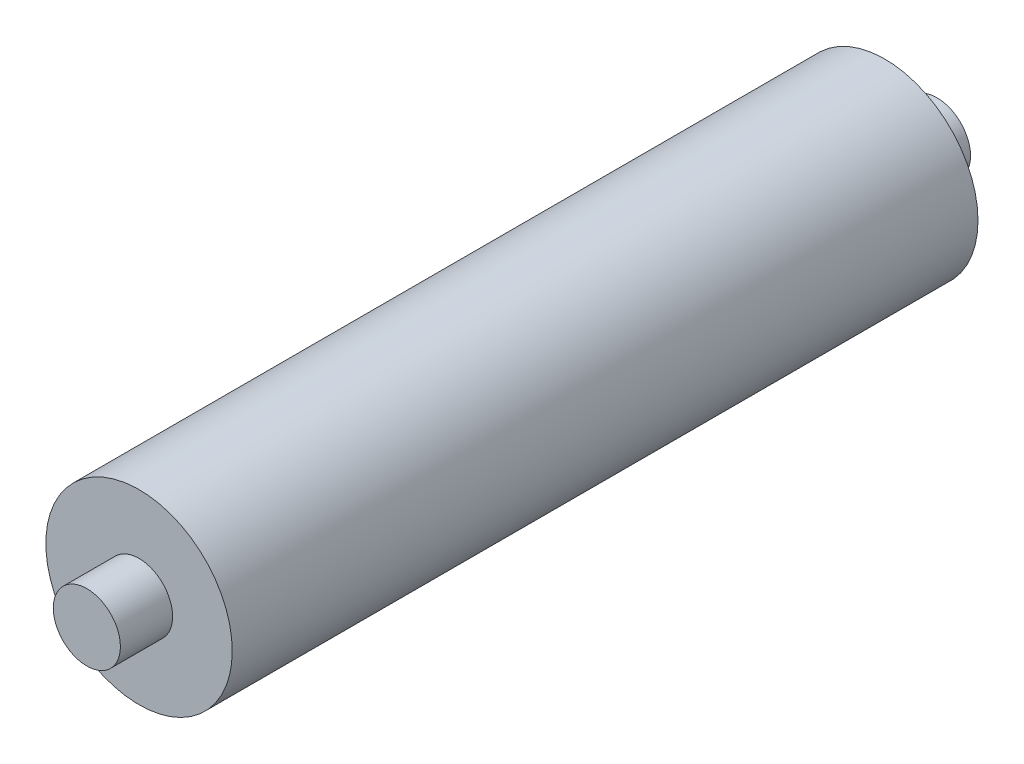
ISO-10303-21;
HEADER;
FILE_DESCRIPTION(('STEP AP214'),'2;1');
FILE_NAME('part.step','',(''),(''),'','','');
FILE_SCHEMA(('AUTOMOTIVE_DESIGN { 1 0 10303 214 1 1 1 1 }'));
ENDSEC;
DATA;
#1=APPLICATION_CONTEXT('core data for automotive mechanical design processes');
#2=APPLICATION_PROTOCOL_DEFINITION('international standard','automotive_design',2000,#1);
#3=PRODUCT_CONTEXT('',#1,'mechanical');
#4=PRODUCT('Part','Part','',(#3));
#5=PRODUCT_RELATED_PRODUCT_CATEGORY('part','',(#4));
#6=PRODUCT_DEFINITION_FORMATION('','',#4);
#7=PRODUCT_DEFINITION_CONTEXT('part definition',#1,'design');
#8=PRODUCT_DEFINITION('design','',#6,#7);
#9=PRODUCT_DEFINITION_SHAPE('','',#8);
#10=(LENGTH_UNIT() NAMED_UNIT(*) SI_UNIT(.MILLI.,.METRE.));
#11=(NAMED_UNIT(*) PLANE_ANGLE_UNIT() SI_UNIT($,.RADIAN.));
#12=(NAMED_UNIT(*) SI_UNIT($,.STERADIAN.) SOLID_ANGLE_UNIT());
#13=UNCERTAINTY_MEASURE_WITH_UNIT(LENGTH_MEASURE(1.E-05),#10,'distance_accuracy_value','');
#14=(GEOMETRIC_REPRESENTATION_CONTEXT(3) GLOBAL_UNCERTAINTY_ASSIGNED_CONTEXT((#13)) GLOBAL_UNIT_ASSIGNED_CONTEXT((#10,
#11,#12)) REPRESENTATION_CONTEXT('',''));
#15=CARTESIAN_POINT('',(0.,0.,0.));
#16=DIRECTION('',(0.,0.,1.));
#17=DIRECTION('',(1.,0.,0.));
#18=AXIS2_PLACEMENT_3D('',#15,#16,#17);
#19=CARTESIAN_POINT('',(0.,0.,7.));
#20=DIRECTION('',(0.,0.,-1.));
#21=DIRECTION('',(-1.,0.,0.));
#22=AXIS2_PLACEMENT_3D('',#19,#20,#21);
#23=CYLINDRICAL_SURFACE('',#22,4.5);
#24=CARTESIAN_POINT('',(0.,0.,7.));
#25=DIRECTION('',(0.,0.,1.));
#26=DIRECTION('',(1.,0.,0.));
#27=AXIS2_PLACEMENT_3D('',#24,#25,#26);
#28=CIRCLE('',#27,4.5);
#29=CARTESIAN_POINT('',(4.5,0.,7.));
#30=VERTEX_POINT('',#29);
#31=EDGE_CURVE('E10',#30,#30,#28,.T.);
#32=ORIENTED_EDGE('',*,*,#31,.F.);
#33=EDGE_LOOP('',(#32));
#34=FACE_BOUND('',#33,.T.);
#35=CARTESIAN_POINT('',(0.,0.,0.));
#36=DIRECTION('',(0.,0.,1.));
#37=DIRECTION('',(1.,0.,0.));
#38=AXIS2_PLACEMENT_3D('',#35,#36,#37);
#39=CIRCLE('',#38,4.5);
#40=CARTESIAN_POINT('',(4.5,0.,0.));
#41=VERTEX_POINT('',#40);
#42=EDGE_CURVE('E42',#41,#41,#39,.T.);
#43=ORIENTED_EDGE('',*,*,#42,.T.);
#44=EDGE_LOOP('',(#43));
#45=FACE_BOUND('',#44,.T.);
#46=ADVANCED_FACE('F39',(#34,#45),#23,.T.);
#47=CARTESIAN_POINT('',(0.,0.,0.));
#48=DIRECTION('',(0.,0.,1.));
#49=DIRECTION('',(1.,0.,0.));
#50=AXIS2_PLACEMENT_3D('',#47,#48,#49);
#51=PLANE('',#50);
#52=ORIENTED_EDGE('',*,*,#42,.F.);
#53=EDGE_LOOP('',(#52));
#54=FACE_BOUND('',#53,.T.);
#55=ADVANCED_FACE('F68',(#54),#51,.F.);
#56=CARTESIAN_POINT('',(0.,0.,57.));
#57=DIRECTION('',(0.,0.,-1.));
#58=DIRECTION('',(-1.,0.,0.));
#59=AXIS2_PLACEMENT_3D('',#56,#57,#58);
#60=CYLINDRICAL_SURFACE('',#59,12.5);
#61=CARTESIAN_POINT('',(0.,0.,7.));
#62=DIRECTION('',(0.,0.,1.));
#63=DIRECTION('',(1.,0.,0.));
#64=AXIS2_PLACEMENT_3D('',#61,#62,#63);
#65=CIRCLE('',#64,12.5);
#66=CARTESIAN_POINT('',(12.5,0.,7.));
#67=VERTEX_POINT('',#66);
#68=EDGE_CURVE('E49',#67,#67,#65,.T.);
#69=ORIENTED_EDGE('',*,*,#68,.T.);
#70=EDGE_LOOP('',(#69));
#71=FACE_BOUND('',#70,.T.);
#72=CARTESIAN_POINT('',(0.,0.,107.));
#73=DIRECTION('',(0.,0.,1.));
#74=DIRECTION('',(1.,0.,0.));
#75=AXIS2_PLACEMENT_3D('',#72,#73,#74);
#76=CIRCLE('',#75,12.5);
#77=CARTESIAN_POINT('',(12.5,0.,107.));
#78=VERTEX_POINT('',#77);
#79=EDGE_CURVE('E57',#78,#78,#76,.T.);
#80=ORIENTED_EDGE('',*,*,#79,.F.);
#81=EDGE_LOOP('',(#80));
#82=FACE_BOUND('',#81,.T.);
#83=ADVANCED_FACE('F65',(#71,#82),#60,.T.);
#84=CARTESIAN_POINT('',(0.,0.,7.));
#85=DIRECTION('',(0.,0.,1.));
#86=DIRECTION('',(1.,0.,0.));
#87=AXIS2_PLACEMENT_3D('',#84,#85,#86);
#88=PLANE('',#87);
#89=ORIENTED_EDGE('',*,*,#31,.T.);
#90=EDGE_LOOP('',(#89));
#91=FACE_BOUND('',#90,.T.);
#92=ORIENTED_EDGE('',*,*,#68,.F.);
#93=EDGE_LOOP('',(#92));
#94=FACE_BOUND('',#93,.T.);
#95=ADVANCED_FACE('F67',(#91,#94),#88,.F.);
#96=CARTESIAN_POINT('',(0.,0.,107.));
#97=DIRECTION('',(0.,0.,1.));
#98=DIRECTION('',(-1.,0.,0.));
#99=AXIS2_PLACEMENT_3D('',#96,#97,#98);
#100=CYLINDRICAL_SURFACE('',#99,4.5);
#101=CARTESIAN_POINT('',(0.,0.,107.));
#102=DIRECTION('',(0.,0.,1.));
#103=DIRECTION('',(1.,0.,0.));
#104=AXIS2_PLACEMENT_3D('',#101,#102,#103);
#105=CIRCLE('',#104,4.5);
#106=CARTESIAN_POINT('',(4.5,0.,107.));
#107=VERTEX_POINT('',#106);
#108=EDGE_CURVE('E53',#107,#107,#105,.T.);
#109=ORIENTED_EDGE('',*,*,#108,.T.);
#110=EDGE_LOOP('',(#109));
#111=FACE_BOUND('',#110,.T.);
#112=CARTESIAN_POINT('',(0.,0.,114.));
#113=DIRECTION('',(0.,0.,1.));
#114=DIRECTION('',(1.,0.,0.));
#115=AXIS2_PLACEMENT_3D('',#112,#113,#114);
#116=CIRCLE('',#115,4.5);
#117=CARTESIAN_POINT('',(4.5,0.,114.));
#118=VERTEX_POINT('',#117);
#119=EDGE_CURVE('E54',#118,#118,#116,.T.);
#120=ORIENTED_EDGE('',*,*,#119,.F.);
#121=EDGE_LOOP('',(#120));
#122=FACE_BOUND('',#121,.T.);
#123=ADVANCED_FACE('F76',(#111,#122),#100,.T.);
#124=CARTESIAN_POINT('',(0.,0.,114.));
#125=DIRECTION('',(0.,0.,-1.));
#126=DIRECTION('',(1.,0.,0.));
#127=AXIS2_PLACEMENT_3D('',#124,#125,#126);
#128=PLANE('',#127);
#129=ORIENTED_EDGE('',*,*,#119,.T.);
#130=EDGE_LOOP('',(#129));
#131=FACE_BOUND('',#130,.T.);
#132=ADVANCED_FACE('F100',(#131),#128,.F.);
#133=CARTESIAN_POINT('',(0.,0.,107.));
#134=DIRECTION('',(0.,0.,-1.));
#135=DIRECTION('',(1.,0.,0.));
#136=AXIS2_PLACEMENT_3D('',#133,#134,#135);
#137=PLANE('',#136);
#138=ORIENTED_EDGE('',*,*,#108,.F.);
#139=EDGE_LOOP('',(#138));
#140=FACE_BOUND('',#139,.T.);
#141=ORIENTED_EDGE('',*,*,#79,.T.);
#142=EDGE_LOOP('',(#141));
#143=FACE_BOUND('',#142,.T.);
#144=ADVANCED_FACE('F63',(#140,#143),#137,.F.);
#145=CLOSED_SHELL('',(#46,#55,#83,#95,#123,#132,#144));
#146=MANIFOLD_SOLID_BREP('B2',#145);
#147=ADVANCED_BREP_SHAPE_REPRESENTATION('',(#18,#146),#14);
#148=SHAPE_DEFINITION_REPRESENTATION(#9,#147);
ENDSEC;
END-ISO-10303-21;
